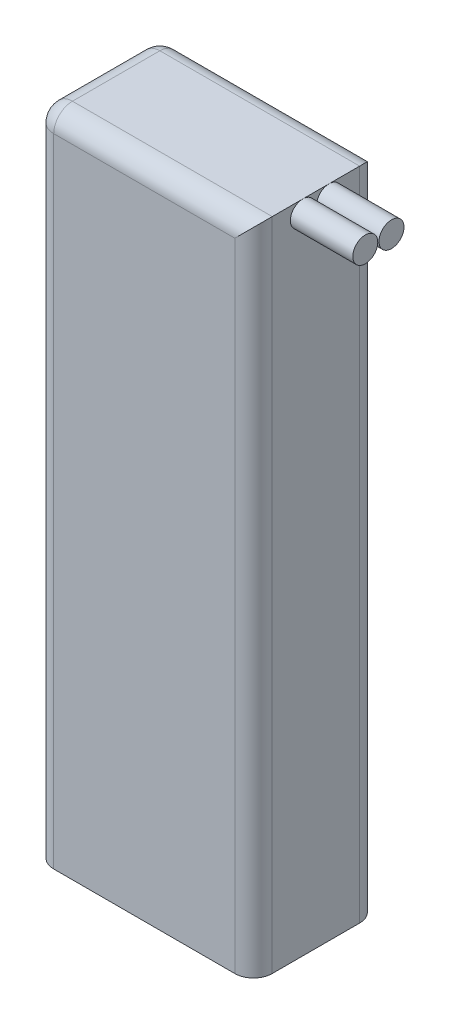
ISO-10303-21;
HEADER;
FILE_DESCRIPTION(('STEP AP214'),'2;1');
FILE_NAME('part.step','',(''),(''),'','','');
FILE_SCHEMA(('AUTOMOTIVE_DESIGN { 1 0 10303 214 1 1 1 1 }'));
ENDSEC;
DATA;
#1=APPLICATION_CONTEXT('core data for automotive mechanical design processes');
#2=APPLICATION_PROTOCOL_DEFINITION('international standard','automotive_design',2000,#1);
#3=PRODUCT_CONTEXT('',#1,'mechanical');
#4=PRODUCT('Part','Part','',(#3));
#5=PRODUCT_RELATED_PRODUCT_CATEGORY('part','',(#4));
#6=PRODUCT_DEFINITION_FORMATION('','',#4);
#7=PRODUCT_DEFINITION_CONTEXT('part definition',#1,'design');
#8=PRODUCT_DEFINITION('design','',#6,#7);
#9=PRODUCT_DEFINITION_SHAPE('','',#8);
#10=(LENGTH_UNIT() NAMED_UNIT(*) SI_UNIT(.MILLI.,.METRE.));
#11=(NAMED_UNIT(*) PLANE_ANGLE_UNIT() SI_UNIT($,.RADIAN.));
#12=(NAMED_UNIT(*) SI_UNIT($,.STERADIAN.) SOLID_ANGLE_UNIT());
#13=UNCERTAINTY_MEASURE_WITH_UNIT(LENGTH_MEASURE(1.E-05),#10,'distance_accuracy_value','');
#14=(GEOMETRIC_REPRESENTATION_CONTEXT(3) GLOBAL_UNCERTAINTY_ASSIGNED_CONTEXT((#13)) GLOBAL_UNIT_ASSIGNED_CONTEXT((#10,
#11,#12)) REPRESENTATION_CONTEXT('',''));
#15=CARTESIAN_POINT('',(0.,0.,0.));
#16=DIRECTION('',(0.,0.,1.));
#17=DIRECTION('',(1.,0.,0.));
#18=AXIS2_PLACEMENT_3D('',#15,#16,#17);
#19=CARTESIAN_POINT('',(0.,105.,0.));
#20=DIRECTION('',(1.,0.,0.));
#21=DIRECTION('',(0.,0.,-1.));
#22=AXIS2_PLACEMENT_3D('',#19,#20,#21);
#23=PLANE('',#22);
#24=DIRECTION('',(0.,0.,1.));
#25=VECTOR('',#24,1.);
#26=CARTESIAN_POINT('',(0.,102.,0.));
#27=LINE('',#26,#25);
#28=CARTESIAN_POINT('',(0.,102.,-3.));
#29=VERTEX_POINT('',#28);
#30=CARTESIAN_POINT('',(0.,102.,-17.));
#31=VERTEX_POINT('',#30);
#32=EDGE_CURVE('E168',#29,#31,#27,.F.);
#33=ORIENTED_EDGE('',*,*,#32,.T.);
#34=DIRECTION('',(0.,-1.,0.));
#35=VECTOR('',#34,1.);
#36=CARTESIAN_POINT('',(0.,105.,-17.));
#37=LINE('',#36,#35);
#38=CARTESIAN_POINT('',(0.,0.,-17.));
#39=VERTEX_POINT('',#38);
#40=EDGE_CURVE('E171',#31,#39,#37,.T.);
#41=ORIENTED_EDGE('',*,*,#40,.T.);
#42=DIRECTION('',(0.,0.,1.));
#43=VECTOR('',#42,1.);
#44=CARTESIAN_POINT('',(0.,0.,0.));
#45=LINE('',#44,#43);
#46=CARTESIAN_POINT('',(0.,0.,-3.));
#47=VERTEX_POINT('',#46);
#48=EDGE_CURVE('E248',#39,#47,#45,.T.);
#49=ORIENTED_EDGE('',*,*,#48,.T.);
#50=DIRECTION('',(0.,-1.,0.));
#51=VECTOR('',#50,1.);
#52=CARTESIAN_POINT('',(0.,105.,-3.));
#53=LINE('',#52,#51);
#54=EDGE_CURVE('E165',#47,#29,#53,.F.);
#55=ORIENTED_EDGE('',*,*,#54,.T.);
#56=EDGE_LOOP('',(#33,#41,#49,#55));
#57=FACE_BOUND('',#56,.T.);
#58=ADVANCED_FACE('F47',(#57),#23,.F.);
#59=CARTESIAN_POINT('',(0.,105.,0.));
#60=DIRECTION('',(0.,0.,-1.));
#61=DIRECTION('',(-1.,0.,0.));
#62=AXIS2_PLACEMENT_3D('',#59,#60,#61);
#63=PLANE('',#62);
#64=DIRECTION('',(1.,0.,0.));
#65=VECTOR('',#64,1.);
#66=CARTESIAN_POINT('',(0.,102.,0.));
#67=LINE('',#66,#65);
#68=CARTESIAN_POINT('',(32.,102.,0.));
#69=VERTEX_POINT('',#68);
#70=CARTESIAN_POINT('',(3.,102.,0.));
#71=VERTEX_POINT('',#70);
#72=EDGE_CURVE('E64',#69,#71,#67,.F.);
#73=ORIENTED_EDGE('',*,*,#72,.T.);
#74=DIRECTION('',(0.,-1.,0.));
#75=VECTOR('',#74,1.);
#76=CARTESIAN_POINT('',(3.,105.,0.));
#77=LINE('',#76,#75);
#78=CARTESIAN_POINT('',(3.,0.,0.));
#79=VERTEX_POINT('',#78);
#80=EDGE_CURVE('E11',#71,#79,#77,.T.);
#81=ORIENTED_EDGE('',*,*,#80,.T.);
#82=DIRECTION('',(1.,0.,0.));
#83=VECTOR('',#82,1.);
#84=CARTESIAN_POINT('',(0.,0.,0.));
#85=LINE('',#84,#83);
#86=CARTESIAN_POINT('',(32.,0.,0.));
#87=VERTEX_POINT('',#86);
#88=EDGE_CURVE('E262',#79,#87,#85,.T.);
#89=ORIENTED_EDGE('',*,*,#88,.T.);
#90=DIRECTION('',(0.,-1.,0.));
#91=VECTOR('',#90,1.);
#92=CARTESIAN_POINT('',(32.,105.,0.));
#93=LINE('',#92,#91);
#94=EDGE_CURVE('E57',#87,#69,#93,.F.);
#95=ORIENTED_EDGE('',*,*,#94,.T.);
#96=EDGE_LOOP('',(#73,#81,#89,#95));
#97=FACE_BOUND('',#96,.T.);
#98=ADVANCED_FACE('F264',(#97),#63,.F.);
#99=CARTESIAN_POINT('',(35.,105.,0.));
#100=DIRECTION('',(-1.,0.,0.));
#101=DIRECTION('',(0.,0.,1.));
#102=AXIS2_PLACEMENT_3D('',#99,#100,#101);
#103=PLANE('',#102);
#104=DIRECTION('',(0.,0.,-1.));
#105=VECTOR('',#104,1.);
#106=CARTESIAN_POINT('',(35.,0.,0.));
#107=LINE('',#106,#105);
#108=CARTESIAN_POINT('',(35.,0.,-3.));
#109=VERTEX_POINT('',#108);
#110=CARTESIAN_POINT('',(35.,0.,-17.));
#111=VERTEX_POINT('',#110);
#112=EDGE_CURVE('E147',#109,#111,#107,.T.);
#113=ORIENTED_EDGE('',*,*,#112,.T.);
#114=DIRECTION('',(0.,-1.,0.));
#115=VECTOR('',#114,1.);
#116=CARTESIAN_POINT('',(35.,105.,-17.));
#117=LINE('',#116,#115);
#118=CARTESIAN_POINT('',(35.,105.,-17.));
#119=VERTEX_POINT('',#118);
#120=EDGE_CURVE('E142',#111,#119,#117,.F.);
#121=ORIENTED_EDGE('',*,*,#120,.T.);
#122=DIRECTION('',(0.,0.,-1.));
#123=VECTOR('',#122,1.);
#124=CARTESIAN_POINT('',(35.,105.,0.));
#125=LINE('',#124,#123);
#126=CARTESIAN_POINT('',(35.,105.,-12.1));
#127=VERTEX_POINT('',#126);
#128=EDGE_CURVE('E128',#127,#119,#125,.T.);
#129=ORIENTED_EDGE('',*,*,#128,.F.);
#130=CARTESIAN_POINT('',(35.,103.,-12.1));
#131=DIRECTION('',(1.,0.,0.));
#132=DIRECTION('',(0.,0.,-1.));
#133=AXIS2_PLACEMENT_3D('',#130,#131,#132);
#134=CIRCLE('',#133,2.00000000000001);
#135=EDGE_CURVE('E140',#127,#127,#134,.T.);
#136=ORIENTED_EDGE('',*,*,#135,.F.);
#137=CARTESIAN_POINT('',(35.,105.,-7.89999999999998));
#138=VERTEX_POINT('',#137);
#139=EDGE_CURVE('E125',#138,#127,#125,.T.);
#140=ORIENTED_EDGE('',*,*,#139,.F.);
#141=CARTESIAN_POINT('',(35.,103.,-7.89999999999998));
#142=DIRECTION('',(1.,0.,0.));
#143=DIRECTION('',(0.,0.,-1.));
#144=AXIS2_PLACEMENT_3D('',#141,#142,#143);
#145=CIRCLE('',#144,2.);
#146=EDGE_CURVE('E242',#138,#138,#145,.T.);
#147=ORIENTED_EDGE('',*,*,#146,.F.);
#148=CARTESIAN_POINT('',(35.,105.,-3.));
#149=VERTEX_POINT('',#148);
#150=EDGE_CURVE('E131',#149,#138,#125,.T.);
#151=ORIENTED_EDGE('',*,*,#150,.F.);
#152=DIRECTION('',(0.,-1.,0.));
#153=VECTOR('',#152,1.);
#154=CARTESIAN_POINT('',(35.,105.,-3.));
#155=LINE('',#154,#153);
#156=EDGE_CURVE('E195',#149,#109,#155,.T.);
#157=ORIENTED_EDGE('',*,*,#156,.T.);
#158=EDGE_LOOP('',(#113,#121,#129,#136,#140,#147,#151,#157));
#159=FACE_BOUND('',#158,.T.);
#160=ADVANCED_FACE('F138',(#159),#103,.F.);
#161=CARTESIAN_POINT('',(0.,105.,-20.));
#162=DIRECTION('',(0.,0.,1.));
#163=DIRECTION('',(1.,0.,0.));
#164=AXIS2_PLACEMENT_3D('',#161,#162,#163);
#165=PLANE('',#164);
#166=DIRECTION('',(-1.,0.,0.));
#167=VECTOR('',#166,1.);
#168=CARTESIAN_POINT('',(0.,0.,-20.));
#169=LINE('',#168,#167);
#170=CARTESIAN_POINT('',(32.,0.,-20.));
#171=VERTEX_POINT('',#170);
#172=CARTESIAN_POINT('',(3.00000000000001,0.,-20.));
#173=VERTEX_POINT('',#172);
#174=EDGE_CURVE('E144',#171,#173,#169,.T.);
#175=ORIENTED_EDGE('',*,*,#174,.T.);
#176=DIRECTION('',(0.,-1.,0.));
#177=VECTOR('',#176,1.);
#178=CARTESIAN_POINT('',(3.00000000000001,105.,-20.));
#179=LINE('',#178,#177);
#180=CARTESIAN_POINT('',(3.00000000000001,102.,-20.));
#181=VERTEX_POINT('',#180);
#182=EDGE_CURVE('E180',#173,#181,#179,.F.);
#183=ORIENTED_EDGE('',*,*,#182,.T.);
#184=DIRECTION('',(-1.,0.,0.));
#185=VECTOR('',#184,1.);
#186=CARTESIAN_POINT('',(0.,102.,-20.));
#187=LINE('',#186,#185);
#188=CARTESIAN_POINT('',(32.,102.,-20.));
#189=VERTEX_POINT('',#188);
#190=EDGE_CURVE('E177',#181,#189,#187,.F.);
#191=ORIENTED_EDGE('',*,*,#190,.T.);
#192=DIRECTION('',(0.,-1.,0.));
#193=VECTOR('',#192,1.);
#194=CARTESIAN_POINT('',(32.,105.,-20.));
#195=LINE('',#194,#193);
#196=EDGE_CURVE('E174',#189,#171,#195,.T.);
#197=ORIENTED_EDGE('',*,*,#196,.T.);
#198=EDGE_LOOP('',(#175,#183,#191,#197));
#199=FACE_BOUND('',#198,.T.);
#200=ADVANCED_FACE('F298',(#199),#165,.F.);
#201=CARTESIAN_POINT('',(0.,105.,0.));
#202=DIRECTION('',(0.,-1.,0.));
#203=DIRECTION('',(0.,0.,-1.));
#204=AXIS2_PLACEMENT_3D('',#201,#202,#203);
#205=PLANE('',#204);
#206=ORIENTED_EDGE('',*,*,#128,.T.);
#207=DIRECTION('',(-1.,0.,0.));
#208=VECTOR('',#207,1.);
#209=CARTESIAN_POINT('',(0.,105.,-17.));
#210=LINE('',#209,#208);
#211=CARTESIAN_POINT('',(3.00000000000001,105.,-17.));
#212=VERTEX_POINT('',#211);
#213=EDGE_CURVE('E159',#119,#212,#210,.T.);
#214=ORIENTED_EDGE('',*,*,#213,.T.);
#215=DIRECTION('',(0.,0.,1.));
#216=VECTOR('',#215,1.);
#217=CARTESIAN_POINT('',(3.,105.,0.));
#218=LINE('',#217,#216);
#219=CARTESIAN_POINT('',(3.,105.,-3.));
#220=VERTEX_POINT('',#219);
#221=EDGE_CURVE('E154',#212,#220,#218,.T.);
#222=ORIENTED_EDGE('',*,*,#221,.T.);
#223=DIRECTION('',(1.,0.,0.));
#224=VECTOR('',#223,1.);
#225=CARTESIAN_POINT('',(0.,105.,-3.));
#226=LINE('',#225,#224);
#227=EDGE_CURVE('E152',#220,#149,#226,.T.);
#228=ORIENTED_EDGE('',*,*,#227,.T.);
#229=ORIENTED_EDGE('',*,*,#150,.T.);
#230=ORIENTED_EDGE('',*,*,#139,.T.);
#231=EDGE_LOOP('',(#206,#214,#222,#228,#229,#230));
#232=FACE_BOUND('',#231,.T.);
#233=ADVANCED_FACE('F127',(#232),#205,.F.);
#234=CARTESIAN_POINT('',(0.,0.,0.));
#235=DIRECTION('',(0.,-1.,0.));
#236=DIRECTION('',(0.,0.,-1.));
#237=AXIS2_PLACEMENT_3D('',#234,#235,#236);
#238=PLANE('',#237);
#239=ORIENTED_EDGE('',*,*,#48,.F.);
#240=CARTESIAN_POINT('',(3.00000000000001,0.,-17.));
#241=DIRECTION('',(0.,-1.,0.));
#242=DIRECTION('',(0.,0.,-1.));
#243=AXIS2_PLACEMENT_3D('',#240,#241,#242);
#244=CIRCLE('',#243,3.);
#245=EDGE_CURVE('E192',#39,#173,#244,.T.);
#246=ORIENTED_EDGE('',*,*,#245,.T.);
#247=ORIENTED_EDGE('',*,*,#174,.F.);
#248=CARTESIAN_POINT('',(32.,0.,-17.));
#249=DIRECTION('',(0.,-1.,0.));
#250=DIRECTION('',(0.,0.,-1.));
#251=AXIS2_PLACEMENT_3D('',#248,#249,#250);
#252=CIRCLE('',#251,3.);
#253=EDGE_CURVE('E189',#171,#111,#252,.T.);
#254=ORIENTED_EDGE('',*,*,#253,.T.);
#255=ORIENTED_EDGE('',*,*,#112,.F.);
#256=CARTESIAN_POINT('',(32.,0.,-3.));
#257=DIRECTION('',(0.,-1.,0.));
#258=DIRECTION('',(0.,0.,-1.));
#259=AXIS2_PLACEMENT_3D('',#256,#257,#258);
#260=CIRCLE('',#259,3.);
#261=EDGE_CURVE('E183',#109,#87,#260,.T.);
#262=ORIENTED_EDGE('',*,*,#261,.T.);
#263=ORIENTED_EDGE('',*,*,#88,.F.);
#264=CARTESIAN_POINT('',(3.,0.,-3.));
#265=DIRECTION('',(0.,-1.,0.));
#266=DIRECTION('',(0.,0.,-1.));
#267=AXIS2_PLACEMENT_3D('',#264,#265,#266);
#268=CIRCLE('',#267,3.);
#269=EDGE_CURVE('E186',#79,#47,#268,.T.);
#270=ORIENTED_EDGE('',*,*,#269,.T.);
#271=EDGE_LOOP('',(#239,#246,#247,#254,#255,#262,#263,#270));
#272=FACE_BOUND('',#271,.T.);
#273=ADVANCED_FACE('F261',(#272),#238,.T.);
#274=CARTESIAN_POINT('',(45.,103.,-7.89999999999999));
#275=DIRECTION('',(-1.,0.,0.));
#276=DIRECTION('',(0.,0.,1.));
#277=AXIS2_PLACEMENT_3D('',#274,#275,#276);
#278=CYLINDRICAL_SURFACE('',#277,2.);
#279=CARTESIAN_POINT('',(45.,103.,-7.89999999999999));
#280=DIRECTION('',(1.,0.,0.));
#281=DIRECTION('',(0.,0.,-1.));
#282=AXIS2_PLACEMENT_3D('',#279,#280,#281);
#283=CIRCLE('',#282,2.);
#284=CARTESIAN_POINT('',(45.,103.,-9.89999999999998));
#285=VERTEX_POINT('',#284);
#286=EDGE_CURVE('E245',#285,#285,#283,.T.);
#287=ORIENTED_EDGE('',*,*,#286,.F.);
#288=EDGE_LOOP('',(#287));
#289=FACE_BOUND('',#288,.T.);
#290=ORIENTED_EDGE('',*,*,#146,.T.);
#291=EDGE_LOOP('',(#290));
#292=FACE_BOUND('',#291,.T.);
#293=ADVANCED_FACE('F252',(#289,#292),#278,.T.);
#294=CARTESIAN_POINT('',(45.,103.,-7.89999999999999));
#295=DIRECTION('',(1.,0.,0.));
#296=DIRECTION('',(0.,0.,-1.));
#297=AXIS2_PLACEMENT_3D('',#294,#295,#296);
#298=PLANE('',#297);
#299=ORIENTED_EDGE('',*,*,#286,.T.);
#300=EDGE_LOOP('',(#299));
#301=FACE_BOUND('',#300,.T.);
#302=ADVANCED_FACE('F394',(#301),#298,.T.);
#303=CARTESIAN_POINT('',(45.,103.,-12.1));
#304=DIRECTION('',(-1.,0.,0.));
#305=DIRECTION('',(0.,0.,1.));
#306=AXIS2_PLACEMENT_3D('',#303,#304,#305);
#307=CYLINDRICAL_SURFACE('',#306,2.00000000000001);
#308=CARTESIAN_POINT('',(45.,103.,-12.1));
#309=DIRECTION('',(1.,0.,0.));
#310=DIRECTION('',(0.,0.,-1.));
#311=AXIS2_PLACEMENT_3D('',#308,#309,#310);
#312=CIRCLE('',#311,2.00000000000001);
#313=CARTESIAN_POINT('',(45.,103.,-14.1));
#314=VERTEX_POINT('',#313);
#315=EDGE_CURVE('E232',#314,#314,#312,.T.);
#316=ORIENTED_EDGE('',*,*,#315,.F.);
#317=EDGE_LOOP('',(#316));
#318=FACE_BOUND('',#317,.T.);
#319=ORIENTED_EDGE('',*,*,#135,.T.);
#320=EDGE_LOOP('',(#319));
#321=FACE_BOUND('',#320,.T.);
#322=ADVANCED_FACE('F308',(#318,#321),#307,.T.);
#323=CARTESIAN_POINT('',(45.,103.,-12.1));
#324=DIRECTION('',(1.,0.,0.));
#325=DIRECTION('',(0.,0.,-1.));
#326=AXIS2_PLACEMENT_3D('',#323,#324,#325);
#327=PLANE('',#326);
#328=ORIENTED_EDGE('',*,*,#315,.T.);
#329=EDGE_LOOP('',(#328));
#330=FACE_BOUND('',#329,.T.);
#331=ADVANCED_FACE('F302',(#330),#327,.T.);
#332=CARTESIAN_POINT('',(32.,105.,-17.));
#333=DIRECTION('',(0.,-1.,0.));
#334=DIRECTION('',(0.,0.,-1.));
#335=AXIS2_PLACEMENT_3D('',#332,#333,#334);
#336=CYLINDRICAL_SURFACE('',#335,3.);
#337=ORIENTED_EDGE('',*,*,#253,.F.);
#338=ORIENTED_EDGE('',*,*,#196,.F.);
#339=CARTESIAN_POINT('',(32.,102.,-17.));
#340=DIRECTION('',(0.707106781186547,-0.707106781186547,0.));
#341=DIRECTION('',(-0.707106781186547,-0.707106781186547,0.));
#342=AXIS2_PLACEMENT_3D('',#339,#340,#341);
#343=ELLIPSE('',#342,4.24264068711928,3.);
#344=EDGE_CURVE('E51',#119,#189,#343,.F.);
#345=ORIENTED_EDGE('',*,*,#344,.F.);
#346=ORIENTED_EDGE('',*,*,#120,.F.);
#347=EDGE_LOOP('',(#337,#338,#345,#346));
#348=FACE_BOUND('',#347,.T.);
#349=ADVANCED_FACE('F49',(#348),#336,.T.);
#350=CARTESIAN_POINT('',(32.,105.,-3.));
#351=DIRECTION('',(0.,-1.,0.));
#352=DIRECTION('',(0.,0.,-1.));
#353=AXIS2_PLACEMENT_3D('',#350,#351,#352);
#354=CYLINDRICAL_SURFACE('',#353,3.);
#355=ORIENTED_EDGE('',*,*,#261,.F.);
#356=ORIENTED_EDGE('',*,*,#156,.F.);
#357=CARTESIAN_POINT('',(32.,102.,-3.));
#358=DIRECTION('',(0.707106781186547,-0.707106781186547,0.));
#359=DIRECTION('',(0.707106781186547,0.707106781186547,0.));
#360=AXIS2_PLACEMENT_3D('',#357,#358,#359);
#361=ELLIPSE('',#360,4.24264068711928,3.);
#362=EDGE_CURVE('E226',#69,#149,#361,.F.);
#363=ORIENTED_EDGE('',*,*,#362,.F.);
#364=ORIENTED_EDGE('',*,*,#94,.F.);
#365=EDGE_LOOP('',(#355,#356,#363,#364));
#366=FACE_BOUND('',#365,.T.);
#367=ADVANCED_FACE('F257',(#366),#354,.T.);
#368=CARTESIAN_POINT('',(3.00000000000001,105.,-17.));
#369=DIRECTION('',(0.,-1.,0.));
#370=DIRECTION('',(0.,0.,-1.));
#371=AXIS2_PLACEMENT_3D('',#368,#369,#370);
#372=CYLINDRICAL_SURFACE('',#371,3.);
#373=ORIENTED_EDGE('',*,*,#245,.F.);
#374=ORIENTED_EDGE('',*,*,#40,.F.);
#375=CARTESIAN_POINT('',(3.00000000000001,102.,-17.));
#376=DIRECTION('',(0.,1.,0.));
#377=DIRECTION('',(0.,0.,1.));
#378=AXIS2_PLACEMENT_3D('',#375,#376,#377);
#379=CIRCLE('',#378,3.);
#380=EDGE_CURVE('E223',#181,#31,#379,.T.);
#381=ORIENTED_EDGE('',*,*,#380,.F.);
#382=ORIENTED_EDGE('',*,*,#182,.F.);
#383=EDGE_LOOP('',(#373,#374,#381,#382));
#384=FACE_BOUND('',#383,.T.);
#385=ADVANCED_FACE('F294',(#384),#372,.T.);
#386=CARTESIAN_POINT('',(0.,102.,-17.));
#387=DIRECTION('',(-1.,0.,0.));
#388=DIRECTION('',(0.,0.,1.));
#389=AXIS2_PLACEMENT_3D('',#386,#387,#388);
#390=CYLINDRICAL_SURFACE('',#389,3.);
#391=ORIENTED_EDGE('',*,*,#344,.T.);
#392=ORIENTED_EDGE('',*,*,#190,.F.);
#393=CARTESIAN_POINT('',(3.00000000000001,102.,-17.));
#394=DIRECTION('',(-1.,0.,0.));
#395=DIRECTION('',(0.,0.,1.));
#396=AXIS2_PLACEMENT_3D('',#393,#394,#395);
#397=CIRCLE('',#396,3.);
#398=EDGE_CURVE('E219',#212,#181,#397,.T.);
#399=ORIENTED_EDGE('',*,*,#398,.F.);
#400=ORIENTED_EDGE('',*,*,#213,.F.);
#401=EDGE_LOOP('',(#391,#392,#399,#400));
#402=FACE_BOUND('',#401,.T.);
#403=ADVANCED_FACE('F288',(#402),#390,.T.);
#404=CARTESIAN_POINT('',(0.,102.,-3.));
#405=DIRECTION('',(1.,0.,0.));
#406=DIRECTION('',(0.,0.,-1.));
#407=AXIS2_PLACEMENT_3D('',#404,#405,#406);
#408=CYLINDRICAL_SURFACE('',#407,3.);
#409=ORIENTED_EDGE('',*,*,#362,.T.);
#410=ORIENTED_EDGE('',*,*,#227,.F.);
#411=CARTESIAN_POINT('',(3.,102.,-3.));
#412=DIRECTION('',(-1.,0.,0.));
#413=DIRECTION('',(0.,0.,1.));
#414=AXIS2_PLACEMENT_3D('',#411,#412,#413);
#415=CIRCLE('',#414,3.);
#416=EDGE_CURVE('E215',#71,#220,#415,.T.);
#417=ORIENTED_EDGE('',*,*,#416,.F.);
#418=ORIENTED_EDGE('',*,*,#72,.F.);
#419=EDGE_LOOP('',(#409,#410,#417,#418));
#420=FACE_BOUND('',#419,.T.);
#421=ADVANCED_FACE('F286',(#420),#408,.T.);
#422=CARTESIAN_POINT('',(3.,105.,-3.));
#423=DIRECTION('',(0.,-1.,0.));
#424=DIRECTION('',(0.,0.,-1.));
#425=AXIS2_PLACEMENT_3D('',#422,#423,#424);
#426=CYLINDRICAL_SURFACE('',#425,3.);
#427=ORIENTED_EDGE('',*,*,#269,.F.);
#428=ORIENTED_EDGE('',*,*,#80,.F.);
#429=CARTESIAN_POINT('',(3.,102.,-3.));
#430=DIRECTION('',(0.,1.,0.));
#431=DIRECTION('',(0.,0.,1.));
#432=AXIS2_PLACEMENT_3D('',#429,#430,#431);
#433=CIRCLE('',#432,3.);
#434=EDGE_CURVE('E211',#29,#71,#433,.T.);
#435=ORIENTED_EDGE('',*,*,#434,.F.);
#436=ORIENTED_EDGE('',*,*,#54,.F.);
#437=EDGE_LOOP('',(#427,#428,#435,#436));
#438=FACE_BOUND('',#437,.T.);
#439=ADVANCED_FACE('F276',(#438),#426,.T.);
#440=CARTESIAN_POINT('',(3.00000000000001,102.,-17.));
#441=DIRECTION('',(0.,0.,-1.));
#442=DIRECTION('',(-1.,0.,0.));
#443=AXIS2_PLACEMENT_3D('',#440,#441,#442);
#444=SPHERICAL_SURFACE('',#443,3.);
#445=ORIENTED_EDGE('',*,*,#398,.T.);
#446=ORIENTED_EDGE('',*,*,#380,.T.);
#447=CARTESIAN_POINT('',(3.00000000000001,102.,-17.));
#448=DIRECTION('',(0.,0.,-1.));
#449=DIRECTION('',(-1.,0.,0.));
#450=AXIS2_PLACEMENT_3D('',#447,#448,#449);
#451=CIRCLE('',#450,3.);
#452=EDGE_CURVE('E207',#212,#31,#451,.F.);
#453=ORIENTED_EDGE('',*,*,#452,.F.);
#454=EDGE_LOOP('',(#445,#446,#453));
#455=FACE_BOUND('',#454,.T.);
#456=ADVANCED_FACE('F291',(#455),#444,.T.);
#457=CARTESIAN_POINT('',(3.,102.,-3.));
#458=DIRECTION('',(0.,0.,1.));
#459=DIRECTION('',(1.,0.,0.));
#460=AXIS2_PLACEMENT_3D('',#457,#458,#459);
#461=SPHERICAL_SURFACE('',#460,3.);
#462=ORIENTED_EDGE('',*,*,#434,.T.);
#463=ORIENTED_EDGE('',*,*,#416,.T.);
#464=CARTESIAN_POINT('',(3.,102.,-3.));
#465=DIRECTION('',(0.,0.,1.));
#466=DIRECTION('',(1.,0.,0.));
#467=AXIS2_PLACEMENT_3D('',#464,#465,#466);
#468=CIRCLE('',#467,3.);
#469=EDGE_CURVE('E204',#29,#220,#468,.F.);
#470=ORIENTED_EDGE('',*,*,#469,.F.);
#471=EDGE_LOOP('',(#462,#463,#470));
#472=FACE_BOUND('',#471,.T.);
#473=ADVANCED_FACE('F285',(#472),#461,.T.);
#474=CARTESIAN_POINT('',(3.,102.,0.));
#475=DIRECTION('',(0.,0.,1.));
#476=DIRECTION('',(1.,0.,0.));
#477=AXIS2_PLACEMENT_3D('',#474,#475,#476);
#478=CYLINDRICAL_SURFACE('',#477,3.);
#479=ORIENTED_EDGE('',*,*,#452,.T.);
#480=ORIENTED_EDGE('',*,*,#32,.F.);
#481=ORIENTED_EDGE('',*,*,#469,.T.);
#482=ORIENTED_EDGE('',*,*,#221,.F.);
#483=EDGE_LOOP('',(#479,#480,#481,#482));
#484=FACE_BOUND('',#483,.T.);
#485=ADVANCED_FACE('F282',(#484),#478,.T.);
#486=CLOSED_SHELL('',(#58,#98,#160,#200,#233,#273,#293,#302,#322,#331,#349,#367,#385,#403,#421,
#439,#456,#473,#485));
#487=MANIFOLD_SOLID_BREP('B2',#486);
#488=ADVANCED_BREP_SHAPE_REPRESENTATION('',(#18,#487),#14);
#489=SHAPE_DEFINITION_REPRESENTATION(#9,#488);
ENDSEC;
END-ISO-10303-21;
